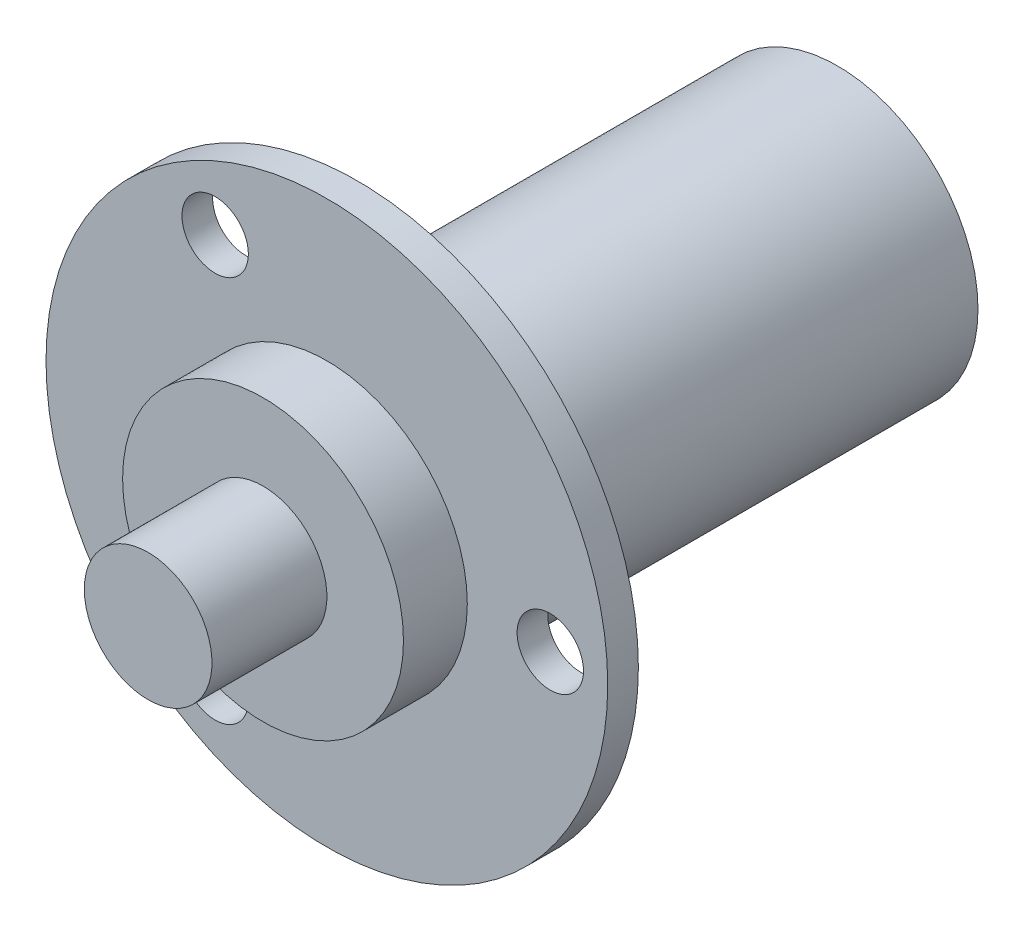
ISO-10303-21;
HEADER;
FILE_DESCRIPTION(('STEP AP214'),'2;1');
FILE_NAME('part.step','',(''),(''),'','','');
FILE_SCHEMA(('AUTOMOTIVE_DESIGN { 1 0 10303 214 1 1 1 1 }'));
ENDSEC;
DATA;
#1=APPLICATION_CONTEXT('core data for automotive mechanical design processes');
#2=APPLICATION_PROTOCOL_DEFINITION('international standard','automotive_design',2000,#1);
#3=PRODUCT_CONTEXT('',#1,'mechanical');
#4=PRODUCT('Part','Part','',(#3));
#5=PRODUCT_RELATED_PRODUCT_CATEGORY('part','',(#4));
#6=PRODUCT_DEFINITION_FORMATION('','',#4);
#7=PRODUCT_DEFINITION_CONTEXT('part definition',#1,'design');
#8=PRODUCT_DEFINITION('design','',#6,#7);
#9=PRODUCT_DEFINITION_SHAPE('','',#8);
#10=(LENGTH_UNIT() NAMED_UNIT(*) SI_UNIT(.MILLI.,.METRE.));
#11=(NAMED_UNIT(*) PLANE_ANGLE_UNIT() SI_UNIT($,.RADIAN.));
#12=(NAMED_UNIT(*) SI_UNIT($,.STERADIAN.) SOLID_ANGLE_UNIT());
#13=UNCERTAINTY_MEASURE_WITH_UNIT(LENGTH_MEASURE(1.E-05),#10,'distance_accuracy_value','');
#14=(GEOMETRIC_REPRESENTATION_CONTEXT(3) GLOBAL_UNCERTAINTY_ASSIGNED_CONTEXT((#13)) GLOBAL_UNIT_ASSIGNED_CONTEXT((#10,
#11,#12)) REPRESENTATION_CONTEXT('',''));
#15=CARTESIAN_POINT('',(0.,0.,0.));
#16=DIRECTION('',(0.,0.,1.));
#17=DIRECTION('',(1.,0.,0.));
#18=AXIS2_PLACEMENT_3D('',#15,#16,#17);
#19=CARTESIAN_POINT('',(0.,0.,0.));
#20=DIRECTION('',(0.,0.,1.));
#21=DIRECTION('',(1.,0.,0.));
#22=AXIS2_PLACEMENT_3D('',#19,#20,#21);
#23=PLANE('',#22);
#24=CARTESIAN_POINT('',(0.,0.,0.));
#25=DIRECTION('',(0.,0.,-1.));
#26=DIRECTION('',(-1.,0.,0.));
#27=AXIS2_PLACEMENT_3D('',#24,#25,#26);
#28=CIRCLE('',#27,5.);
#29=CARTESIAN_POINT('',(-5.,0.,0.));
#30=VERTEX_POINT('',#29);
#31=EDGE_CURVE('E10',#30,#30,#28,.T.);
#32=ORIENTED_EDGE('',*,*,#31,.F.);
#33=EDGE_LOOP('',(#32));
#34=FACE_BOUND('',#33,.T.);
#35=ADVANCED_FACE('F37',(#34),#23,.T.);
#36=CARTESIAN_POINT('',(0.,0.,-54.));
#37=DIRECTION('',(0.,0.,-1.));
#38=DIRECTION('',(-1.,0.,0.));
#39=AXIS2_PLACEMENT_3D('',#36,#37,#38);
#40=CYLINDRICAL_SURFACE('',#39,5.);
#41=ORIENTED_EDGE('',*,*,#31,.T.);
#42=EDGE_LOOP('',(#41));
#43=FACE_BOUND('',#42,.T.);
#44=CARTESIAN_POINT('',(0.,0.,-9.));
#45=DIRECTION('',(0.,0.,-1.));
#46=DIRECTION('',(-1.,0.,0.));
#47=AXIS2_PLACEMENT_3D('',#44,#45,#46);
#48=CIRCLE('',#47,5.);
#49=CARTESIAN_POINT('',(-5.,0.,-9.));
#50=VERTEX_POINT('',#49);
#51=EDGE_CURVE('E44',#50,#50,#48,.T.);
#52=ORIENTED_EDGE('',*,*,#51,.F.);
#53=EDGE_LOOP('',(#52));
#54=FACE_BOUND('',#53,.T.);
#55=ADVANCED_FACE('F91',(#43,#54),#40,.T.);
#56=CARTESIAN_POINT('',(-5.,0.,-9.));
#57=DIRECTION('',(0.,0.,1.));
#58=DIRECTION('',(1.,0.,0.));
#59=AXIS2_PLACEMENT_3D('',#56,#57,#58);
#60=PLANE('',#59);
#61=ORIENTED_EDGE('',*,*,#51,.T.);
#62=EDGE_LOOP('',(#61));
#63=FACE_BOUND('',#62,.T.);
#64=CARTESIAN_POINT('',(0.,0.,-9.));
#65=DIRECTION('',(0.,0.,-1.));
#66=DIRECTION('',(-1.,0.,0.));
#67=AXIS2_PLACEMENT_3D('',#64,#65,#66);
#68=CIRCLE('',#67,11.);
#69=CARTESIAN_POINT('',(-11.,0.,-9.));
#70=VERTEX_POINT('',#69);
#71=EDGE_CURVE('E49',#70,#70,#68,.T.);
#72=ORIENTED_EDGE('',*,*,#71,.F.);
#73=EDGE_LOOP('',(#72));
#74=FACE_BOUND('',#73,.T.);
#75=ADVANCED_FACE('F89',(#63,#74),#60,.T.);
#76=CARTESIAN_POINT('',(0.,0.,-54.));
#77=DIRECTION('',(0.,0.,-1.));
#78=DIRECTION('',(-1.,0.,0.));
#79=AXIS2_PLACEMENT_3D('',#76,#77,#78);
#80=CYLINDRICAL_SURFACE('',#79,11.);
#81=ORIENTED_EDGE('',*,*,#71,.T.);
#82=EDGE_LOOP('',(#81));
#83=FACE_BOUND('',#82,.T.);
#84=CARTESIAN_POINT('',(0.,0.,-14.));
#85=DIRECTION('',(0.,0.,-1.));
#86=DIRECTION('',(-1.,0.,0.));
#87=AXIS2_PLACEMENT_3D('',#84,#85,#86);
#88=CIRCLE('',#87,11.);
#89=CARTESIAN_POINT('',(-11.,0.,-14.));
#90=VERTEX_POINT('',#89);
#91=EDGE_CURVE('E81',#90,#90,#88,.T.);
#92=ORIENTED_EDGE('',*,*,#91,.F.);
#93=EDGE_LOOP('',(#92));
#94=FACE_BOUND('',#93,.T.);
#95=ADVANCED_FACE('F86',(#83,#94),#80,.T.);
#96=CARTESIAN_POINT('',(-11.,0.,-14.));
#97=DIRECTION('',(0.,0.,1.));
#98=DIRECTION('',(1.,0.,0.));
#99=AXIS2_PLACEMENT_3D('',#96,#97,#98);
#100=PLANE('',#99);
#101=CARTESIAN_POINT('',(17.5,0.,-14.));
#102=DIRECTION('',(0.,0.,1.));
#103=DIRECTION('',(1.,0.,0.));
#104=AXIS2_PLACEMENT_3D('',#101,#102,#103);
#105=CIRCLE('',#104,2.6);
#106=CARTESIAN_POINT('',(20.1,0.,-14.));
#107=VERTEX_POINT('',#106);
#108=EDGE_CURVE('E56',#107,#107,#105,.T.);
#109=ORIENTED_EDGE('',*,*,#108,.F.);
#110=EDGE_LOOP('',(#109));
#111=FACE_BOUND('',#110,.T.);
#112=CARTESIAN_POINT('',(-8.75,-15.1554445662277,-14.));
#113=DIRECTION('',(0.,0.,1.));
#114=DIRECTION('',(1.,0.,0.));
#115=AXIS2_PLACEMENT_3D('',#112,#113,#114);
#116=CIRCLE('',#115,2.6);
#117=CARTESIAN_POINT('',(-6.15,-15.1554445662277,-14.));
#118=VERTEX_POINT('',#117);
#119=EDGE_CURVE('E179',#118,#118,#116,.T.);
#120=ORIENTED_EDGE('',*,*,#119,.F.);
#121=EDGE_LOOP('',(#120));
#122=FACE_BOUND('',#121,.T.);
#123=CARTESIAN_POINT('',(-8.75000000000001,15.1554445662277,-14.));
#124=DIRECTION('',(0.,0.,1.));
#125=DIRECTION('',(1.,0.,0.));
#126=AXIS2_PLACEMENT_3D('',#123,#124,#125);
#127=CIRCLE('',#126,2.6);
#128=CARTESIAN_POINT('',(-6.15000000000001,15.1554445662277,-14.));
#129=VERTEX_POINT('',#128);
#130=EDGE_CURVE('E73',#129,#129,#127,.T.);
#131=ORIENTED_EDGE('',*,*,#130,.F.);
#132=EDGE_LOOP('',(#131));
#133=FACE_BOUND('',#132,.T.);
#134=ORIENTED_EDGE('',*,*,#91,.T.);
#135=EDGE_LOOP('',(#134));
#136=FACE_BOUND('',#135,.T.);
#137=CARTESIAN_POINT('',(0.,0.,-14.));
#138=DIRECTION('',(0.,0.,-1.));
#139=DIRECTION('',(-1.,0.,0.));
#140=AXIS2_PLACEMENT_3D('',#137,#138,#139);
#141=CIRCLE('',#140,22.);
#142=CARTESIAN_POINT('',(-22.,0.,-14.));
#143=VERTEX_POINT('',#142);
#144=EDGE_CURVE('E78',#143,#143,#141,.T.);
#145=ORIENTED_EDGE('',*,*,#144,.F.);
#146=EDGE_LOOP('',(#145));
#147=FACE_BOUND('',#146,.T.);
#148=ADVANCED_FACE('F98',(#111,#122,#133,#136,#147),#100,.T.);
#149=CARTESIAN_POINT('',(0.,0.,-54.));
#150=DIRECTION('',(0.,0.,-1.));
#151=DIRECTION('',(-1.,0.,0.));
#152=AXIS2_PLACEMENT_3D('',#149,#150,#151);
#153=CYLINDRICAL_SURFACE('',#152,22.);
#154=ORIENTED_EDGE('',*,*,#144,.T.);
#155=EDGE_LOOP('',(#154));
#156=FACE_BOUND('',#155,.T.);
#157=CARTESIAN_POINT('',(0.,0.,-16.4));
#158=DIRECTION('',(0.,0.,-1.));
#159=DIRECTION('',(-1.,0.,0.));
#160=AXIS2_PLACEMENT_3D('',#157,#158,#159);
#161=CIRCLE('',#160,22.);
#162=CARTESIAN_POINT('',(-22.,0.,-16.4));
#163=VERTEX_POINT('',#162);
#164=EDGE_CURVE('E70',#163,#163,#161,.T.);
#165=ORIENTED_EDGE('',*,*,#164,.F.);
#166=EDGE_LOOP('',(#165));
#167=FACE_BOUND('',#166,.T.);
#168=ADVANCED_FACE('F122',(#156,#167),#153,.T.);
#169=CARTESIAN_POINT('',(-22.,0.,-16.4));
#170=DIRECTION('',(0.,0.,-1.));
#171=DIRECTION('',(-1.,0.,0.));
#172=AXIS2_PLACEMENT_3D('',#169,#170,#171);
#173=PLANE('',#172);
#174=CARTESIAN_POINT('',(17.5,0.,-16.4));
#175=DIRECTION('',(0.,0.,-1.));
#176=DIRECTION('',(-1.,0.,0.));
#177=AXIS2_PLACEMENT_3D('',#174,#175,#176);
#178=CIRCLE('',#177,2.6);
#179=CARTESIAN_POINT('',(14.9,0.,-16.4));
#180=VERTEX_POINT('',#179);
#181=EDGE_CURVE('E40',#180,#180,#178,.T.);
#182=ORIENTED_EDGE('',*,*,#181,.F.);
#183=EDGE_LOOP('',(#182));
#184=FACE_BOUND('',#183,.T.);
#185=CARTESIAN_POINT('',(-8.75,-15.1554445662277,-16.4));
#186=DIRECTION('',(0.,0.,-1.));
#187=DIRECTION('',(-1.,0.,0.));
#188=AXIS2_PLACEMENT_3D('',#185,#186,#187);
#189=CIRCLE('',#188,2.6);
#190=CARTESIAN_POINT('',(-11.35,-15.1554445662277,-16.4));
#191=VERTEX_POINT('',#190);
#192=EDGE_CURVE('E55',#191,#191,#189,.T.);
#193=ORIENTED_EDGE('',*,*,#192,.F.);
#194=EDGE_LOOP('',(#193));
#195=FACE_BOUND('',#194,.T.);
#196=CARTESIAN_POINT('',(-8.75000000000001,15.1554445662277,-16.4));
#197=DIRECTION('',(0.,0.,-1.));
#198=DIRECTION('',(-1.,0.,0.));
#199=AXIS2_PLACEMENT_3D('',#196,#197,#198);
#200=CIRCLE('',#199,2.6);
#201=CARTESIAN_POINT('',(-11.35,15.1554445662277,-16.4));
#202=VERTEX_POINT('',#201);
#203=EDGE_CURVE('E53',#202,#202,#200,.T.);
#204=ORIENTED_EDGE('',*,*,#203,.F.);
#205=EDGE_LOOP('',(#204));
#206=FACE_BOUND('',#205,.T.);
#207=ORIENTED_EDGE('',*,*,#164,.T.);
#208=EDGE_LOOP('',(#207));
#209=FACE_BOUND('',#208,.T.);
#210=CARTESIAN_POINT('',(0.,0.,-16.4));
#211=DIRECTION('',(0.,0.,-1.));
#212=DIRECTION('',(-1.,0.,0.));
#213=AXIS2_PLACEMENT_3D('',#210,#211,#212);
#214=CIRCLE('',#213,11.);
#215=CARTESIAN_POINT('',(-11.,0.,-16.4));
#216=VERTEX_POINT('',#215);
#217=EDGE_CURVE('E65',#216,#216,#214,.T.);
#218=ORIENTED_EDGE('',*,*,#217,.F.);
#219=EDGE_LOOP('',(#218));
#220=FACE_BOUND('',#219,.T.);
#221=ADVANCED_FACE('F131',(#184,#195,#206,#209,#220),#173,.T.);
#222=CARTESIAN_POINT('',(0.,0.,-54.));
#223=DIRECTION('',(0.,0.,-1.));
#224=DIRECTION('',(-1.,0.,0.));
#225=AXIS2_PLACEMENT_3D('',#222,#223,#224);
#226=CYLINDRICAL_SURFACE('',#225,11.);
#227=ORIENTED_EDGE('',*,*,#217,.T.);
#228=EDGE_LOOP('',(#227));
#229=FACE_BOUND('',#228,.T.);
#230=CARTESIAN_POINT('',(0.,0.,-54.));
#231=DIRECTION('',(0.,0.,-1.));
#232=DIRECTION('',(-1.,0.,0.));
#233=AXIS2_PLACEMENT_3D('',#230,#231,#232);
#234=CIRCLE('',#233,11.);
#235=CARTESIAN_POINT('',(-11.,0.,-54.));
#236=VERTEX_POINT('',#235);
#237=EDGE_CURVE('E61',#236,#236,#234,.T.);
#238=ORIENTED_EDGE('',*,*,#237,.F.);
#239=EDGE_LOOP('',(#238));
#240=FACE_BOUND('',#239,.T.);
#241=ADVANCED_FACE('F139',(#229,#240),#226,.T.);
#242=CARTESIAN_POINT('',(-11.,0.,-54.));
#243=DIRECTION('',(0.,0.,-1.));
#244=DIRECTION('',(-1.,0.,0.));
#245=AXIS2_PLACEMENT_3D('',#242,#243,#244);
#246=PLANE('',#245);
#247=ORIENTED_EDGE('',*,*,#237,.T.);
#248=EDGE_LOOP('',(#247));
#249=FACE_BOUND('',#248,.T.);
#250=ADVANCED_FACE('F147',(#249),#246,.T.);
#251=CARTESIAN_POINT('',(-8.75000000000001,15.1554445662277,-24.));
#252=DIRECTION('',(0.,0.,1.));
#253=DIRECTION('',(1.,0.,0.));
#254=AXIS2_PLACEMENT_3D('',#251,#252,#253);
#255=CYLINDRICAL_SURFACE('',#254,2.6);
#256=ORIENTED_EDGE('',*,*,#203,.T.);
#257=EDGE_LOOP('',(#256));
#258=FACE_BOUND('',#257,.T.);
#259=ORIENTED_EDGE('',*,*,#130,.T.);
#260=EDGE_LOOP('',(#259));
#261=FACE_BOUND('',#260,.T.);
#262=ADVANCED_FACE('F154',(#258,#261),#255,.F.);
#263=CARTESIAN_POINT('',(-8.75,-15.1554445662277,-24.));
#264=DIRECTION('',(0.,0.,1.));
#265=DIRECTION('',(1.,0.,0.));
#266=AXIS2_PLACEMENT_3D('',#263,#264,#265);
#267=CYLINDRICAL_SURFACE('',#266,2.6);
#268=ORIENTED_EDGE('',*,*,#192,.T.);
#269=EDGE_LOOP('',(#268));
#270=FACE_BOUND('',#269,.T.);
#271=ORIENTED_EDGE('',*,*,#119,.T.);
#272=EDGE_LOOP('',(#271));
#273=FACE_BOUND('',#272,.T.);
#274=ADVANCED_FACE('F160',(#270,#273),#267,.F.);
#275=CARTESIAN_POINT('',(17.5,0.,-24.));
#276=DIRECTION('',(0.,0.,1.));
#277=DIRECTION('',(1.,0.,0.));
#278=AXIS2_PLACEMENT_3D('',#275,#276,#277);
#279=CYLINDRICAL_SURFACE('',#278,2.6);
#280=ORIENTED_EDGE('',*,*,#181,.T.);
#281=EDGE_LOOP('',(#280));
#282=FACE_BOUND('',#281,.T.);
#283=ORIENTED_EDGE('',*,*,#108,.T.);
#284=EDGE_LOOP('',(#283));
#285=FACE_BOUND('',#284,.T.);
#286=ADVANCED_FACE('F168',(#282,#285),#279,.F.);
#287=CLOSED_SHELL('',(#35,#55,#75,#95,#148,#168,#221,#241,#250,#262,#274,#286));
#288=MANIFOLD_SOLID_BREP('B2',#287);
#289=ADVANCED_BREP_SHAPE_REPRESENTATION('',(#18,#288),#14);
#290=SHAPE_DEFINITION_REPRESENTATION(#9,#289);
ENDSEC;
END-ISO-10303-21;
